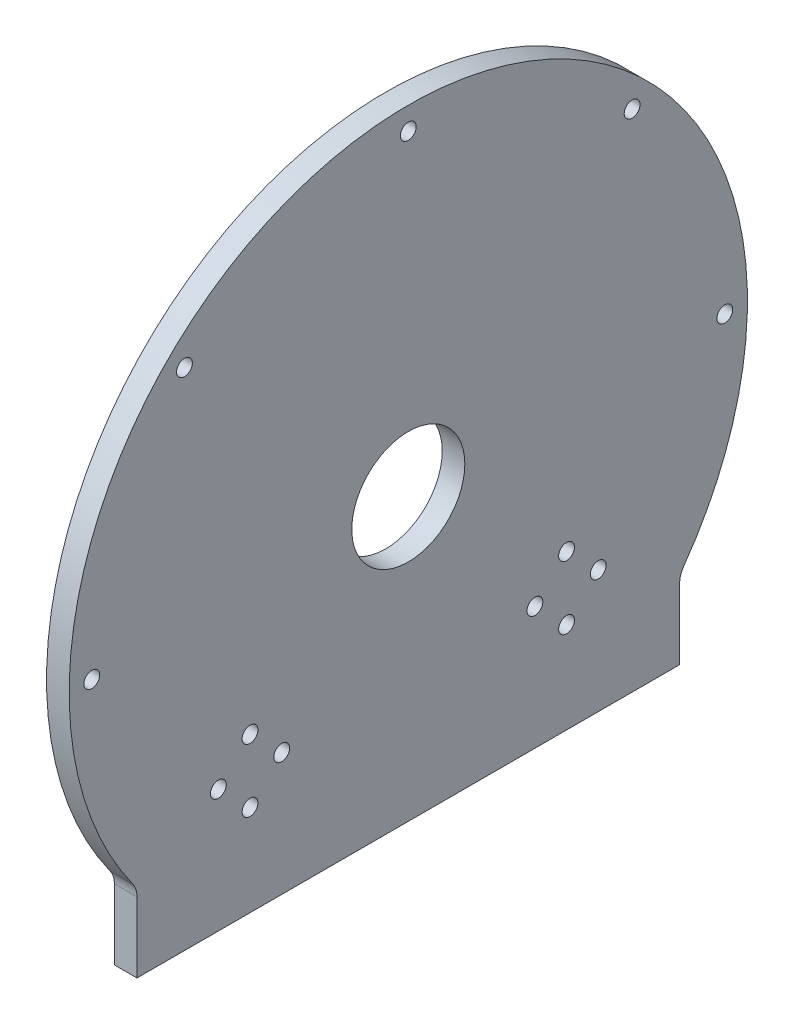
ISO-10303-21;
HEADER;
FILE_DESCRIPTION(('STEP AP214'),'2;1');
FILE_NAME('part.step','',(''),(''),'','','');
FILE_SCHEMA(('AUTOMOTIVE_DESIGN { 1 0 10303 214 1 1 1 1 }'));
ENDSEC;
DATA;
#1=APPLICATION_CONTEXT('core data for automotive mechanical design processes');
#2=APPLICATION_PROTOCOL_DEFINITION('international standard','automotive_design',2000,#1);
#3=PRODUCT_CONTEXT('',#1,'mechanical');
#4=PRODUCT('Part','Part','',(#3));
#5=PRODUCT_RELATED_PRODUCT_CATEGORY('part','',(#4));
#6=PRODUCT_DEFINITION_FORMATION('','',#4);
#7=PRODUCT_DEFINITION_CONTEXT('part definition',#1,'design');
#8=PRODUCT_DEFINITION('design','',#6,#7);
#9=PRODUCT_DEFINITION_SHAPE('','',#8);
#10=(LENGTH_UNIT() NAMED_UNIT(*) SI_UNIT(.MILLI.,.METRE.));
#11=(NAMED_UNIT(*) PLANE_ANGLE_UNIT() SI_UNIT($,.RADIAN.));
#12=(NAMED_UNIT(*) SI_UNIT($,.STERADIAN.) SOLID_ANGLE_UNIT());
#13=UNCERTAINTY_MEASURE_WITH_UNIT(LENGTH_MEASURE(1.E-05),#10,'distance_accuracy_value','');
#14=(GEOMETRIC_REPRESENTATION_CONTEXT(3) GLOBAL_UNCERTAINTY_ASSIGNED_CONTEXT((#13)) GLOBAL_UNIT_ASSIGNED_CONTEXT((#10,
#11,#12)) REPRESENTATION_CONTEXT('',''));
#15=CARTESIAN_POINT('',(0.,0.,0.));
#16=DIRECTION('',(0.,0.,1.));
#17=DIRECTION('',(1.,0.,0.));
#18=AXIS2_PLACEMENT_3D('',#15,#16,#17);
#19=CARTESIAN_POINT('',(5.,205.,-60.));
#20=DIRECTION('',(-1.,0.,0.));
#21=DIRECTION('',(0.,0.,1.));
#22=AXIS2_PLACEMENT_3D('',#19,#20,#21);
#23=PLANE('',#22);
#24=CARTESIAN_POINT('',(5.,254.497474683058,-10.5025253169412));
#25=DIRECTION('',(1.,0.,0.));
#26=DIRECTION('',(0.,0.,-1.));
#27=AXIS2_PLACEMENT_3D('',#24,#25,#26);
#28=CIRCLE('',#27,1.75);
#29=CARTESIAN_POINT('',(5.,254.497474683058,-12.2525253169412));
#30=VERTEX_POINT('',#29);
#31=EDGE_CURVE('E251',#30,#30,#28,.T.);
#32=ORIENTED_EDGE('',*,*,#31,.F.);
#33=EDGE_LOOP('',(#32));
#34=FACE_BOUND('',#33,.T.);
#35=CARTESIAN_POINT('',(5.,205.,10.));
#36=DIRECTION('',(1.,0.,0.));
#37=DIRECTION('',(0.,0.,-1.));
#38=AXIS2_PLACEMENT_3D('',#35,#36,#37);
#39=CIRCLE('',#38,1.75);
#40=CARTESIAN_POINT('',(5.,205.,8.25000000000002));
#41=VERTEX_POINT('',#40);
#42=EDGE_CURVE('E239',#41,#41,#39,.T.);
#43=ORIENTED_EDGE('',*,*,#42,.F.);
#44=EDGE_LOOP('',(#43));
#45=FACE_BOUND('',#44,.T.);
#46=CARTESIAN_POINT('',(5.,170.,-88.));
#47=DIRECTION('',(1.,0.,0.));
#48=DIRECTION('',(0.,0.,-1.));
#49=AXIS2_PLACEMENT_3D('',#46,#47,#48);
#50=CIRCLE('',#49,1.75);
#51=CARTESIAN_POINT('',(5.,170.,-89.75));
#52=VERTEX_POINT('',#51);
#53=EDGE_CURVE('E227',#52,#52,#50,.T.);
#54=ORIENTED_EDGE('',*,*,#53,.F.);
#55=EDGE_LOOP('',(#54));
#56=FACE_BOUND('',#55,.T.);
#57=CARTESIAN_POINT('',(5.,170.,-102.));
#58=DIRECTION('',(1.,0.,0.));
#59=DIRECTION('',(0.,0.,-1.));
#60=AXIS2_PLACEMENT_3D('',#57,#58,#59);
#61=CIRCLE('',#60,1.75);
#62=CARTESIAN_POINT('',(5.,170.,-103.75));
#63=VERTEX_POINT('',#62);
#64=EDGE_CURVE('E215',#63,#63,#61,.T.);
#65=ORIENTED_EDGE('',*,*,#64,.F.);
#66=EDGE_LOOP('',(#65));
#67=FACE_BOUND('',#66,.T.);
#68=CARTESIAN_POINT('',(5.,170.,-18.));
#69=DIRECTION('',(1.,0.,0.));
#70=DIRECTION('',(0.,0.,-1.));
#71=AXIS2_PLACEMENT_3D('',#68,#69,#70);
#72=CIRCLE('',#71,1.75);
#73=CARTESIAN_POINT('',(5.,170.,-19.75));
#74=VERTEX_POINT('',#73);
#75=EDGE_CURVE('E203',#74,#74,#72,.T.);
#76=ORIENTED_EDGE('',*,*,#75,.F.);
#77=EDGE_LOOP('',(#76));
#78=FACE_BOUND('',#77,.T.);
#79=CARTESIAN_POINT('',(5.,170.,-32.));
#80=DIRECTION('',(1.,0.,0.));
#81=DIRECTION('',(0.,0.,-1.));
#82=AXIS2_PLACEMENT_3D('',#79,#80,#81);
#83=CIRCLE('',#82,1.75);
#84=CARTESIAN_POINT('',(5.,170.,-33.75));
#85=VERTEX_POINT('',#84);
#86=EDGE_CURVE('E191',#85,#85,#83,.T.);
#87=ORIENTED_EDGE('',*,*,#86,.F.);
#88=EDGE_LOOP('',(#87));
#89=FACE_BOUND('',#88,.T.);
#90=CARTESIAN_POINT('',(5.,205.,-60.));
#91=DIRECTION('',(1.,0.,0.));
#92=DIRECTION('',(0.,0.,-1.));
#93=AXIS2_PLACEMENT_3D('',#90,#91,#92);
#94=CIRCLE('',#93,12.5);
#95=CARTESIAN_POINT('',(5.,205.,-72.5));
#96=VERTEX_POINT('',#95);
#97=EDGE_CURVE('E179',#96,#96,#94,.T.);
#98=ORIENTED_EDGE('',*,*,#97,.F.);
#99=EDGE_LOOP('',(#98));
#100=FACE_BOUND('',#99,.T.);
#101=DIRECTION('',(0.,-1.,0.));
#102=VECTOR('',#101,1.);
#103=CARTESIAN_POINT('',(5.,0.,0.));
#104=LINE('',#103,#102);
#105=CARTESIAN_POINT('',(5.,158.363104734556,0.));
#106=VERTEX_POINT('',#105);
#107=CARTESIAN_POINT('',(5.,142.822592062885,0.));
#108=VERTEX_POINT('',#107);
#109=EDGE_CURVE('E122',#106,#108,#104,.T.);
#110=ORIENTED_EDGE('',*,*,#109,.T.);
#111=DIRECTION('',(0.,0.,-1.));
#112=VECTOR('',#111,1.);
#113=CARTESIAN_POINT('',(5.,142.822592062885,-60.));
#114=LINE('',#113,#112);
#115=CARTESIAN_POINT('',(4.99999999999989,142.822592062885,-120.));
#116=VERTEX_POINT('',#115);
#117=EDGE_CURVE('E54',#108,#116,#114,.T.);
#118=ORIENTED_EDGE('',*,*,#117,.T.);
#119=DIRECTION('',(0.,1.,0.));
#120=VECTOR('',#119,1.);
#121=CARTESIAN_POINT('',(5.,0.,-120.));
#122=LINE('',#121,#120);
#123=CARTESIAN_POINT('',(5.,158.363104734556,-120.));
#124=VERTEX_POINT('',#123);
#125=EDGE_CURVE('E110',#116,#124,#122,.T.);
#126=ORIENTED_EDGE('',*,*,#125,.T.);
#127=CARTESIAN_POINT('',(5.,158.363104734556,-125.));
#128=DIRECTION('',(-1.,0.,0.));
#129=DIRECTION('',(0.,0.,1.));
#130=AXIS2_PLACEMENT_3D('',#127,#128,#129);
#131=CIRCLE('',#130,5.);
#132=CARTESIAN_POINT('',(5.,161.277910688646,-120.9375));
#133=VERTEX_POINT('',#132);
#134=EDGE_CURVE('E47',#124,#133,#131,.T.);
#135=ORIENTED_EDGE('',*,*,#134,.T.);
#136=CARTESIAN_POINT('',(5.,205.,-60.));
#137=DIRECTION('',(1.,0.,0.));
#138=DIRECTION('',(0.,0.,1.));
#139=AXIS2_PLACEMENT_3D('',#136,#137,#138);
#140=CIRCLE('',#139,75.);
#141=CARTESIAN_POINT('',(5.,161.277910688646,0.937500000000008));
#142=VERTEX_POINT('',#141);
#143=EDGE_CURVE('E113',#133,#142,#140,.T.);
#144=ORIENTED_EDGE('',*,*,#143,.T.);
#145=CARTESIAN_POINT('',(5.,158.363104734556,5.));
#146=DIRECTION('',(-1.,0.,0.));
#147=DIRECTION('',(0.,0.,1.));
#148=AXIS2_PLACEMENT_3D('',#145,#146,#147);
#149=CIRCLE('',#148,5.);
#150=EDGE_CURVE('E61',#142,#106,#149,.T.);
#151=ORIENTED_EDGE('',*,*,#150,.T.);
#152=EDGE_LOOP('',(#110,#118,#126,#135,#144,#151));
#153=FACE_BOUND('',#152,.T.);
#154=CARTESIAN_POINT('',(5.,177.,-25.));
#155=DIRECTION('',(1.,0.,0.));
#156=DIRECTION('',(0.,0.,-1.));
#157=AXIS2_PLACEMENT_3D('',#154,#155,#156);
#158=CIRCLE('',#157,1.75);
#159=CARTESIAN_POINT('',(5.,177.,-26.75));
#160=VERTEX_POINT('',#159);
#161=EDGE_CURVE('E186',#160,#160,#158,.T.);
#162=ORIENTED_EDGE('',*,*,#161,.F.);
#163=EDGE_LOOP('',(#162));
#164=FACE_BOUND('',#163,.T.);
#165=CARTESIAN_POINT('',(5.,163.,-25.));
#166=DIRECTION('',(1.,0.,0.));
#167=DIRECTION('',(0.,0.,-1.));
#168=AXIS2_PLACEMENT_3D('',#165,#166,#167);
#169=CIRCLE('',#168,1.75);
#170=CARTESIAN_POINT('',(5.,163.,-26.75));
#171=VERTEX_POINT('',#170);
#172=EDGE_CURVE('E197',#171,#171,#169,.T.);
#173=ORIENTED_EDGE('',*,*,#172,.F.);
#174=EDGE_LOOP('',(#173));
#175=FACE_BOUND('',#174,.T.);
#176=CARTESIAN_POINT('',(5.,177.,-95.));
#177=DIRECTION('',(1.,0.,0.));
#178=DIRECTION('',(0.,0.,-1.));
#179=AXIS2_PLACEMENT_3D('',#176,#177,#178);
#180=CIRCLE('',#179,1.75);
#181=CARTESIAN_POINT('',(5.,177.,-96.75));
#182=VERTEX_POINT('',#181);
#183=EDGE_CURVE('E209',#182,#182,#180,.T.);
#184=ORIENTED_EDGE('',*,*,#183,.F.);
#185=EDGE_LOOP('',(#184));
#186=FACE_BOUND('',#185,.T.);
#187=CARTESIAN_POINT('',(5.,163.,-95.));
#188=DIRECTION('',(1.,0.,0.));
#189=DIRECTION('',(0.,0.,-1.));
#190=AXIS2_PLACEMENT_3D('',#187,#188,#189);
#191=CIRCLE('',#190,1.75);
#192=CARTESIAN_POINT('',(5.,163.,-96.75));
#193=VERTEX_POINT('',#192);
#194=EDGE_CURVE('E221',#193,#193,#191,.T.);
#195=ORIENTED_EDGE('',*,*,#194,.F.);
#196=EDGE_LOOP('',(#195));
#197=FACE_BOUND('',#196,.T.);
#198=CARTESIAN_POINT('',(5.,275.,-60.));
#199=DIRECTION('',(1.,0.,0.));
#200=DIRECTION('',(0.,0.,-1.));
#201=AXIS2_PLACEMENT_3D('',#198,#199,#200);
#202=CIRCLE('',#201,1.75);
#203=CARTESIAN_POINT('',(5.,275.,-61.75));
#204=VERTEX_POINT('',#203);
#205=EDGE_CURVE('E233',#204,#204,#202,.T.);
#206=ORIENTED_EDGE('',*,*,#205,.F.);
#207=EDGE_LOOP('',(#206));
#208=FACE_BOUND('',#207,.T.);
#209=CARTESIAN_POINT('',(5.,205.,-130.));
#210=DIRECTION('',(1.,0.,0.));
#211=DIRECTION('',(0.,0.,-1.));
#212=AXIS2_PLACEMENT_3D('',#209,#210,#211);
#213=CIRCLE('',#212,1.75000000000001);
#214=CARTESIAN_POINT('',(5.,205.,-131.75));
#215=VERTEX_POINT('',#214);
#216=EDGE_CURVE('E245',#215,#215,#213,.T.);
#217=ORIENTED_EDGE('',*,*,#216,.F.);
#218=EDGE_LOOP('',(#217));
#219=FACE_BOUND('',#218,.T.);
#220=CARTESIAN_POINT('',(5.,254.497474683059,-109.497474683058));
#221=DIRECTION('',(1.,0.,0.));
#222=DIRECTION('',(0.,0.,-1.));
#223=AXIS2_PLACEMENT_3D('',#220,#221,#222);
#224=CIRCLE('',#223,1.75);
#225=CARTESIAN_POINT('',(5.,254.497474683059,-111.247474683058));
#226=VERTEX_POINT('',#225);
#227=EDGE_CURVE('E257',#226,#226,#224,.T.);
#228=ORIENTED_EDGE('',*,*,#227,.F.);
#229=EDGE_LOOP('',(#228));
#230=FACE_BOUND('',#229,.T.);
#231=ADVANCED_FACE('F39',(#34,#45,#56,#67,#78,#89,#100,#153,#164,#175,#186,#197,#208,#219,#230),
#23,.F.);
#232=CARTESIAN_POINT('',(0.,205.,-60.));
#233=DIRECTION('',(-1.,0.,0.));
#234=DIRECTION('',(0.,0.,1.));
#235=AXIS2_PLACEMENT_3D('',#232,#233,#234);
#236=PLANE('',#235);
#237=DIRECTION('',(0.,0.,-1.));
#238=VECTOR('',#237,1.);
#239=CARTESIAN_POINT('',(0.,142.822592062885,-60.));
#240=LINE('',#239,#238);
#241=CARTESIAN_POINT('',(-1.11022302462516E-13,142.822592062885,0.));
#242=VERTEX_POINT('',#241);
#243=CARTESIAN_POINT('',(-1.11022302462516E-13,142.822592062885,-120.));
#244=VERTEX_POINT('',#243);
#245=EDGE_CURVE('E92',#242,#244,#240,.T.);
#246=ORIENTED_EDGE('',*,*,#245,.F.);
#247=DIRECTION('',(0.,-1.,0.));
#248=VECTOR('',#247,1.);
#249=CARTESIAN_POINT('',(0.,0.,0.));
#250=LINE('',#249,#248);
#251=CARTESIAN_POINT('',(0.,158.363104734556,0.));
#252=VERTEX_POINT('',#251);
#253=EDGE_CURVE('E101',#252,#242,#250,.T.);
#254=ORIENTED_EDGE('',*,*,#253,.F.);
#255=CARTESIAN_POINT('',(0.,158.363104734556,5.));
#256=DIRECTION('',(-1.,0.,0.));
#257=DIRECTION('',(0.,0.,1.));
#258=AXIS2_PLACEMENT_3D('',#255,#256,#257);
#259=CIRCLE('',#258,5.);
#260=CARTESIAN_POINT('',(0.,161.277910688646,0.937500000000008));
#261=VERTEX_POINT('',#260);
#262=EDGE_CURVE('E129',#252,#261,#259,.F.);
#263=ORIENTED_EDGE('',*,*,#262,.T.);
#264=CARTESIAN_POINT('',(0.,205.,-60.));
#265=DIRECTION('',(1.,0.,0.));
#266=DIRECTION('',(0.,0.,1.));
#267=AXIS2_PLACEMENT_3D('',#264,#265,#266);
#268=CIRCLE('',#267,75.);
#269=CARTESIAN_POINT('',(0.,161.277910688646,-120.9375));
#270=VERTEX_POINT('',#269);
#271=EDGE_CURVE('E111',#270,#261,#268,.T.);
#272=ORIENTED_EDGE('',*,*,#271,.F.);
#273=CARTESIAN_POINT('',(0.,158.363104734556,-125.));
#274=DIRECTION('',(-1.,0.,0.));
#275=DIRECTION('',(0.,0.,1.));
#276=AXIS2_PLACEMENT_3D('',#273,#274,#275);
#277=CIRCLE('',#276,5.);
#278=CARTESIAN_POINT('',(0.,158.363104734556,-120.));
#279=VERTEX_POINT('',#278);
#280=EDGE_CURVE('E132',#270,#279,#277,.F.);
#281=ORIENTED_EDGE('',*,*,#280,.T.);
#282=DIRECTION('',(0.,1.,0.));
#283=VECTOR('',#282,1.);
#284=CARTESIAN_POINT('',(0.,0.,-120.));
#285=LINE('',#284,#283);
#286=EDGE_CURVE('E103',#244,#279,#285,.T.);
#287=ORIENTED_EDGE('',*,*,#286,.F.);
#288=EDGE_LOOP('',(#246,#254,#263,#272,#281,#287));
#289=FACE_BOUND('',#288,.T.);
#290=CARTESIAN_POINT('',(0.,254.497474683058,-10.5025253169412));
#291=DIRECTION('',(1.,0.,0.));
#292=DIRECTION('',(0.,0.,-1.));
#293=AXIS2_PLACEMENT_3D('',#290,#291,#292);
#294=CIRCLE('',#293,1.75);
#295=CARTESIAN_POINT('',(0.,254.497474683058,-12.2525253169412));
#296=VERTEX_POINT('',#295);
#297=EDGE_CURVE('E254',#296,#296,#294,.T.);
#298=ORIENTED_EDGE('',*,*,#297,.T.);
#299=EDGE_LOOP('',(#298));
#300=FACE_BOUND('',#299,.T.);
#301=CARTESIAN_POINT('',(0.,205.,10.));
#302=DIRECTION('',(1.,0.,0.));
#303=DIRECTION('',(0.,0.,-1.));
#304=AXIS2_PLACEMENT_3D('',#301,#302,#303);
#305=CIRCLE('',#304,1.75);
#306=CARTESIAN_POINT('',(0.,205.,8.25000000000002));
#307=VERTEX_POINT('',#306);
#308=EDGE_CURVE('E242',#307,#307,#305,.T.);
#309=ORIENTED_EDGE('',*,*,#308,.T.);
#310=EDGE_LOOP('',(#309));
#311=FACE_BOUND('',#310,.T.);
#312=CARTESIAN_POINT('',(0.,170.,-88.));
#313=DIRECTION('',(1.,0.,0.));
#314=DIRECTION('',(0.,0.,-1.));
#315=AXIS2_PLACEMENT_3D('',#312,#313,#314);
#316=CIRCLE('',#315,1.75);
#317=CARTESIAN_POINT('',(0.,170.,-89.75));
#318=VERTEX_POINT('',#317);
#319=EDGE_CURVE('E230',#318,#318,#316,.T.);
#320=ORIENTED_EDGE('',*,*,#319,.T.);
#321=EDGE_LOOP('',(#320));
#322=FACE_BOUND('',#321,.T.);
#323=CARTESIAN_POINT('',(0.,170.,-102.));
#324=DIRECTION('',(1.,0.,0.));
#325=DIRECTION('',(0.,0.,-1.));
#326=AXIS2_PLACEMENT_3D('',#323,#324,#325);
#327=CIRCLE('',#326,1.75);
#328=CARTESIAN_POINT('',(0.,170.,-103.75));
#329=VERTEX_POINT('',#328);
#330=EDGE_CURVE('E218',#329,#329,#327,.T.);
#331=ORIENTED_EDGE('',*,*,#330,.T.);
#332=EDGE_LOOP('',(#331));
#333=FACE_BOUND('',#332,.T.);
#334=CARTESIAN_POINT('',(0.,170.,-18.));
#335=DIRECTION('',(1.,0.,0.));
#336=DIRECTION('',(0.,0.,-1.));
#337=AXIS2_PLACEMENT_3D('',#334,#335,#336);
#338=CIRCLE('',#337,1.75);
#339=CARTESIAN_POINT('',(0.,170.,-19.75));
#340=VERTEX_POINT('',#339);
#341=EDGE_CURVE('E206',#340,#340,#338,.T.);
#342=ORIENTED_EDGE('',*,*,#341,.T.);
#343=EDGE_LOOP('',(#342));
#344=FACE_BOUND('',#343,.T.);
#345=CARTESIAN_POINT('',(0.,170.,-32.));
#346=DIRECTION('',(1.,0.,0.));
#347=DIRECTION('',(0.,0.,-1.));
#348=AXIS2_PLACEMENT_3D('',#345,#346,#347);
#349=CIRCLE('',#348,1.75);
#350=CARTESIAN_POINT('',(0.,170.,-33.75));
#351=VERTEX_POINT('',#350);
#352=EDGE_CURVE('E194',#351,#351,#349,.T.);
#353=ORIENTED_EDGE('',*,*,#352,.T.);
#354=EDGE_LOOP('',(#353));
#355=FACE_BOUND('',#354,.T.);
#356=CARTESIAN_POINT('',(0.,205.,-60.));
#357=DIRECTION('',(1.,0.,0.));
#358=DIRECTION('',(0.,0.,-1.));
#359=AXIS2_PLACEMENT_3D('',#356,#357,#358);
#360=CIRCLE('',#359,12.5);
#361=CARTESIAN_POINT('',(0.,205.,-72.5));
#362=VERTEX_POINT('',#361);
#363=EDGE_CURVE('E181',#362,#362,#360,.T.);
#364=ORIENTED_EDGE('',*,*,#363,.T.);
#365=EDGE_LOOP('',(#364));
#366=FACE_BOUND('',#365,.T.);
#367=CARTESIAN_POINT('',(0.,177.,-25.));
#368=DIRECTION('',(1.,0.,0.));
#369=DIRECTION('',(0.,0.,-1.));
#370=AXIS2_PLACEMENT_3D('',#367,#368,#369);
#371=CIRCLE('',#370,1.75);
#372=CARTESIAN_POINT('',(0.,177.,-26.75));
#373=VERTEX_POINT('',#372);
#374=EDGE_CURVE('E188',#373,#373,#371,.T.);
#375=ORIENTED_EDGE('',*,*,#374,.T.);
#376=EDGE_LOOP('',(#375));
#377=FACE_BOUND('',#376,.T.);
#378=CARTESIAN_POINT('',(0.,163.,-25.));
#379=DIRECTION('',(1.,0.,0.));
#380=DIRECTION('',(0.,0.,-1.));
#381=AXIS2_PLACEMENT_3D('',#378,#379,#380);
#382=CIRCLE('',#381,1.75);
#383=CARTESIAN_POINT('',(0.,163.,-26.75));
#384=VERTEX_POINT('',#383);
#385=EDGE_CURVE('E200',#384,#384,#382,.T.);
#386=ORIENTED_EDGE('',*,*,#385,.T.);
#387=EDGE_LOOP('',(#386));
#388=FACE_BOUND('',#387,.T.);
#389=CARTESIAN_POINT('',(0.,177.,-95.));
#390=DIRECTION('',(1.,0.,0.));
#391=DIRECTION('',(0.,0.,-1.));
#392=AXIS2_PLACEMENT_3D('',#389,#390,#391);
#393=CIRCLE('',#392,1.75);
#394=CARTESIAN_POINT('',(0.,177.,-96.75));
#395=VERTEX_POINT('',#394);
#396=EDGE_CURVE('E212',#395,#395,#393,.T.);
#397=ORIENTED_EDGE('',*,*,#396,.T.);
#398=EDGE_LOOP('',(#397));
#399=FACE_BOUND('',#398,.T.);
#400=CARTESIAN_POINT('',(0.,163.,-95.));
#401=DIRECTION('',(1.,0.,0.));
#402=DIRECTION('',(0.,0.,-1.));
#403=AXIS2_PLACEMENT_3D('',#400,#401,#402);
#404=CIRCLE('',#403,1.75);
#405=CARTESIAN_POINT('',(0.,163.,-96.75));
#406=VERTEX_POINT('',#405);
#407=EDGE_CURVE('E224',#406,#406,#404,.T.);
#408=ORIENTED_EDGE('',*,*,#407,.T.);
#409=EDGE_LOOP('',(#408));
#410=FACE_BOUND('',#409,.T.);
#411=CARTESIAN_POINT('',(0.,275.,-60.));
#412=DIRECTION('',(1.,0.,0.));
#413=DIRECTION('',(0.,0.,-1.));
#414=AXIS2_PLACEMENT_3D('',#411,#412,#413);
#415=CIRCLE('',#414,1.75);
#416=CARTESIAN_POINT('',(0.,275.,-61.75));
#417=VERTEX_POINT('',#416);
#418=EDGE_CURVE('E236',#417,#417,#415,.T.);
#419=ORIENTED_EDGE('',*,*,#418,.T.);
#420=EDGE_LOOP('',(#419));
#421=FACE_BOUND('',#420,.T.);
#422=CARTESIAN_POINT('',(0.,205.,-130.));
#423=DIRECTION('',(1.,0.,0.));
#424=DIRECTION('',(0.,0.,-1.));
#425=AXIS2_PLACEMENT_3D('',#422,#423,#424);
#426=CIRCLE('',#425,1.75000000000001);
#427=CARTESIAN_POINT('',(0.,205.,-131.75));
#428=VERTEX_POINT('',#427);
#429=EDGE_CURVE('E248',#428,#428,#426,.T.);
#430=ORIENTED_EDGE('',*,*,#429,.T.);
#431=EDGE_LOOP('',(#430));
#432=FACE_BOUND('',#431,.T.);
#433=CARTESIAN_POINT('',(0.,254.497474683059,-109.497474683058));
#434=DIRECTION('',(1.,0.,0.));
#435=DIRECTION('',(0.,0.,-1.));
#436=AXIS2_PLACEMENT_3D('',#433,#434,#435);
#437=CIRCLE('',#436,1.75);
#438=CARTESIAN_POINT('',(0.,254.497474683059,-111.247474683058));
#439=VERTEX_POINT('',#438);
#440=EDGE_CURVE('E260',#439,#439,#437,.T.);
#441=ORIENTED_EDGE('',*,*,#440,.T.);
#442=EDGE_LOOP('',(#441));
#443=FACE_BOUND('',#442,.T.);
#444=ADVANCED_FACE('F99',(#289,#300,#311,#322,#333,#344,#355,#366,#377,#388,#399,#410,#421,#432,
#443),#236,.T.);
#445=CARTESIAN_POINT('',(5.,0.,-120.));
#446=DIRECTION('',(0.,0.,1.));
#447=DIRECTION('',(0.,-1.,0.));
#448=AXIS2_PLACEMENT_3D('',#445,#446,#447);
#449=PLANE('',#448);
#450=ORIENTED_EDGE('',*,*,#125,.F.);
#451=DIRECTION('',(1.,0.,0.));
#452=VECTOR('',#451,1.);
#453=CARTESIAN_POINT('',(-403.358691040627,142.822592062885,-120.));
#454=LINE('',#453,#452);
#455=EDGE_CURVE('E104',#244,#116,#454,.T.);
#456=ORIENTED_EDGE('',*,*,#455,.F.);
#457=ORIENTED_EDGE('',*,*,#286,.T.);
#458=DIRECTION('',(1.,0.,0.));
#459=VECTOR('',#458,1.);
#460=CARTESIAN_POINT('',(5.,158.363104734556,-120.));
#461=LINE('',#460,#459);
#462=EDGE_CURVE('E119',#279,#124,#461,.T.);
#463=ORIENTED_EDGE('',*,*,#462,.T.);
#464=EDGE_LOOP('',(#450,#456,#457,#463));
#465=FACE_BOUND('',#464,.T.);
#466=ADVANCED_FACE('F164',(#465),#449,.F.);
#467=CARTESIAN_POINT('',(5.,205.,-60.));
#468=DIRECTION('',(-1.,0.,0.));
#469=DIRECTION('',(0.,0.,1.));
#470=AXIS2_PLACEMENT_3D('',#467,#468,#469);
#471=CYLINDRICAL_SURFACE('',#470,75.);
#472=ORIENTED_EDGE('',*,*,#271,.T.);
#473=DIRECTION('',(-1.,0.,0.));
#474=VECTOR('',#473,1.);
#475=CARTESIAN_POINT('',(5.,161.277910688646,0.937500000000008));
#476=LINE('',#475,#474);
#477=EDGE_CURVE('E127',#261,#142,#476,.F.);
#478=ORIENTED_EDGE('',*,*,#477,.T.);
#479=ORIENTED_EDGE('',*,*,#143,.F.);
#480=DIRECTION('',(-1.,0.,0.));
#481=VECTOR('',#480,1.);
#482=CARTESIAN_POINT('',(5.,161.277910688646,-120.9375));
#483=LINE('',#482,#481);
#484=EDGE_CURVE('E124',#133,#270,#483,.T.);
#485=ORIENTED_EDGE('',*,*,#484,.T.);
#486=EDGE_LOOP('',(#472,#478,#479,#485));
#487=FACE_BOUND('',#486,.T.);
#488=ADVANCED_FACE('F141',(#487),#471,.T.);
#489=CARTESIAN_POINT('',(5.,0.,0.));
#490=DIRECTION('',(0.,0.,-1.));
#491=DIRECTION('',(-1.,0.,0.));
#492=AXIS2_PLACEMENT_3D('',#489,#490,#491);
#493=PLANE('',#492);
#494=ORIENTED_EDGE('',*,*,#253,.T.);
#495=DIRECTION('',(1.,0.,0.));
#496=VECTOR('',#495,1.);
#497=CARTESIAN_POINT('',(5.,142.822592062885,0.));
#498=LINE('',#497,#496);
#499=EDGE_CURVE('E11',#242,#108,#498,.T.);
#500=ORIENTED_EDGE('',*,*,#499,.T.);
#501=ORIENTED_EDGE('',*,*,#109,.F.);
#502=DIRECTION('',(1.,0.,0.));
#503=VECTOR('',#502,1.);
#504=CARTESIAN_POINT('',(0.,158.363104734556,0.));
#505=LINE('',#504,#503);
#506=EDGE_CURVE('E109',#106,#252,#505,.F.);
#507=ORIENTED_EDGE('',*,*,#506,.T.);
#508=EDGE_LOOP('',(#494,#500,#501,#507));
#509=FACE_BOUND('',#508,.T.);
#510=ADVANCED_FACE('F107',(#509),#493,.F.);
#511=CARTESIAN_POINT('',(5.,205.,-60.));
#512=DIRECTION('',(-1.,0.,0.));
#513=DIRECTION('',(0.,0.,1.));
#514=AXIS2_PLACEMENT_3D('',#511,#512,#513);
#515=CYLINDRICAL_SURFACE('',#514,12.5);
#516=ORIENTED_EDGE('',*,*,#97,.T.);
#517=EDGE_LOOP('',(#516));
#518=FACE_BOUND('',#517,.T.);
#519=ORIENTED_EDGE('',*,*,#363,.F.);
#520=EDGE_LOOP('',(#519));
#521=FACE_BOUND('',#520,.T.);
#522=ADVANCED_FACE('F169',(#518,#521),#515,.F.);
#523=CARTESIAN_POINT('',(5.,177.,-25.));
#524=DIRECTION('',(-1.,0.,0.));
#525=DIRECTION('',(0.,0.,1.));
#526=AXIS2_PLACEMENT_3D('',#523,#524,#525);
#527=CYLINDRICAL_SURFACE('',#526,1.75);
#528=ORIENTED_EDGE('',*,*,#161,.T.);
#529=EDGE_LOOP('',(#528));
#530=FACE_BOUND('',#529,.T.);
#531=ORIENTED_EDGE('',*,*,#374,.F.);
#532=EDGE_LOOP('',(#531));
#533=FACE_BOUND('',#532,.T.);
#534=ADVANCED_FACE('F342',(#530,#533),#527,.F.);
#535=CARTESIAN_POINT('',(5.,170.,-32.));
#536=DIRECTION('',(-1.,0.,0.));
#537=DIRECTION('',(0.,0.,1.));
#538=AXIS2_PLACEMENT_3D('',#535,#536,#537);
#539=CYLINDRICAL_SURFACE('',#538,1.75);
#540=ORIENTED_EDGE('',*,*,#86,.T.);
#541=EDGE_LOOP('',(#540));
#542=FACE_BOUND('',#541,.T.);
#543=ORIENTED_EDGE('',*,*,#352,.F.);
#544=EDGE_LOOP('',(#543));
#545=FACE_BOUND('',#544,.T.);
#546=ADVANCED_FACE('F339',(#542,#545),#539,.F.);
#547=CARTESIAN_POINT('',(5.,163.,-25.));
#548=DIRECTION('',(-1.,0.,0.));
#549=DIRECTION('',(0.,0.,1.));
#550=AXIS2_PLACEMENT_3D('',#547,#548,#549);
#551=CYLINDRICAL_SURFACE('',#550,1.75);
#552=ORIENTED_EDGE('',*,*,#172,.T.);
#553=EDGE_LOOP('',(#552));
#554=FACE_BOUND('',#553,.T.);
#555=ORIENTED_EDGE('',*,*,#385,.F.);
#556=EDGE_LOOP('',(#555));
#557=FACE_BOUND('',#556,.T.);
#558=ADVANCED_FACE('F335',(#554,#557),#551,.F.);
#559=CARTESIAN_POINT('',(5.,170.,-18.));
#560=DIRECTION('',(-1.,0.,0.));
#561=DIRECTION('',(0.,0.,1.));
#562=AXIS2_PLACEMENT_3D('',#559,#560,#561);
#563=CYLINDRICAL_SURFACE('',#562,1.75);
#564=ORIENTED_EDGE('',*,*,#75,.T.);
#565=EDGE_LOOP('',(#564));
#566=FACE_BOUND('',#565,.T.);
#567=ORIENTED_EDGE('',*,*,#341,.F.);
#568=EDGE_LOOP('',(#567));
#569=FACE_BOUND('',#568,.T.);
#570=ADVANCED_FACE('F331',(#566,#569),#563,.F.);
#571=CARTESIAN_POINT('',(5.,177.,-95.));
#572=DIRECTION('',(-1.,0.,0.));
#573=DIRECTION('',(0.,0.,1.));
#574=AXIS2_PLACEMENT_3D('',#571,#572,#573);
#575=CYLINDRICAL_SURFACE('',#574,1.75);
#576=ORIENTED_EDGE('',*,*,#183,.T.);
#577=EDGE_LOOP('',(#576));
#578=FACE_BOUND('',#577,.T.);
#579=ORIENTED_EDGE('',*,*,#396,.F.);
#580=EDGE_LOOP('',(#579));
#581=FACE_BOUND('',#580,.T.);
#582=ADVANCED_FACE('F327',(#578,#581),#575,.F.);
#583=CARTESIAN_POINT('',(5.,170.,-102.));
#584=DIRECTION('',(-1.,0.,0.));
#585=DIRECTION('',(0.,0.,1.));
#586=AXIS2_PLACEMENT_3D('',#583,#584,#585);
#587=CYLINDRICAL_SURFACE('',#586,1.75);
#588=ORIENTED_EDGE('',*,*,#64,.T.);
#589=EDGE_LOOP('',(#588));
#590=FACE_BOUND('',#589,.T.);
#591=ORIENTED_EDGE('',*,*,#330,.F.);
#592=EDGE_LOOP('',(#591));
#593=FACE_BOUND('',#592,.T.);
#594=ADVANCED_FACE('F323',(#590,#593),#587,.F.);
#595=CARTESIAN_POINT('',(5.,163.,-95.));
#596=DIRECTION('',(-1.,0.,0.));
#597=DIRECTION('',(0.,0.,1.));
#598=AXIS2_PLACEMENT_3D('',#595,#596,#597);
#599=CYLINDRICAL_SURFACE('',#598,1.75);
#600=ORIENTED_EDGE('',*,*,#194,.T.);
#601=EDGE_LOOP('',(#600));
#602=FACE_BOUND('',#601,.T.);
#603=ORIENTED_EDGE('',*,*,#407,.F.);
#604=EDGE_LOOP('',(#603));
#605=FACE_BOUND('',#604,.T.);
#606=ADVANCED_FACE('F319',(#602,#605),#599,.F.);
#607=CARTESIAN_POINT('',(5.,170.,-88.));
#608=DIRECTION('',(-1.,0.,0.));
#609=DIRECTION('',(0.,0.,1.));
#610=AXIS2_PLACEMENT_3D('',#607,#608,#609);
#611=CYLINDRICAL_SURFACE('',#610,1.75);
#612=ORIENTED_EDGE('',*,*,#53,.T.);
#613=EDGE_LOOP('',(#612));
#614=FACE_BOUND('',#613,.T.);
#615=ORIENTED_EDGE('',*,*,#319,.F.);
#616=EDGE_LOOP('',(#615));
#617=FACE_BOUND('',#616,.T.);
#618=ADVANCED_FACE('F315',(#614,#617),#611,.F.);
#619=CARTESIAN_POINT('',(5.,275.,-60.));
#620=DIRECTION('',(-1.,0.,0.));
#621=DIRECTION('',(0.,0.,1.));
#622=AXIS2_PLACEMENT_3D('',#619,#620,#621);
#623=CYLINDRICAL_SURFACE('',#622,1.75);
#624=ORIENTED_EDGE('',*,*,#205,.T.);
#625=EDGE_LOOP('',(#624));
#626=FACE_BOUND('',#625,.T.);
#627=ORIENTED_EDGE('',*,*,#418,.F.);
#628=EDGE_LOOP('',(#627));
#629=FACE_BOUND('',#628,.T.);
#630=ADVANCED_FACE('F309',(#626,#629),#623,.F.);
#631=CARTESIAN_POINT('',(5.,205.,10.));
#632=DIRECTION('',(-1.,0.,0.));
#633=DIRECTION('',(0.,0.,1.));
#634=AXIS2_PLACEMENT_3D('',#631,#632,#633);
#635=CYLINDRICAL_SURFACE('',#634,1.75);
#636=ORIENTED_EDGE('',*,*,#42,.T.);
#637=EDGE_LOOP('',(#636));
#638=FACE_BOUND('',#637,.T.);
#639=ORIENTED_EDGE('',*,*,#308,.F.);
#640=EDGE_LOOP('',(#639));
#641=FACE_BOUND('',#640,.T.);
#642=ADVANCED_FACE('F303',(#638,#641),#635,.F.);
#643=CARTESIAN_POINT('',(5.,205.,-130.));
#644=DIRECTION('',(-1.,0.,0.));
#645=DIRECTION('',(0.,0.,1.));
#646=AXIS2_PLACEMENT_3D('',#643,#644,#645);
#647=CYLINDRICAL_SURFACE('',#646,1.75000000000001);
#648=ORIENTED_EDGE('',*,*,#216,.T.);
#649=EDGE_LOOP('',(#648));
#650=FACE_BOUND('',#649,.T.);
#651=ORIENTED_EDGE('',*,*,#429,.F.);
#652=EDGE_LOOP('',(#651));
#653=FACE_BOUND('',#652,.T.);
#654=ADVANCED_FACE('F274',(#650,#653),#647,.F.);
#655=CARTESIAN_POINT('',(5.,254.497474683058,-10.5025253169412));
#656=DIRECTION('',(-1.,0.,0.));
#657=DIRECTION('',(0.,0.,1.));
#658=AXIS2_PLACEMENT_3D('',#655,#656,#657);
#659=CYLINDRICAL_SURFACE('',#658,1.75);
#660=ORIENTED_EDGE('',*,*,#31,.T.);
#661=EDGE_LOOP('',(#660));
#662=FACE_BOUND('',#661,.T.);
#663=ORIENTED_EDGE('',*,*,#297,.F.);
#664=EDGE_LOOP('',(#663));
#665=FACE_BOUND('',#664,.T.);
#666=ADVANCED_FACE('F153',(#662,#665),#659,.F.);
#667=CARTESIAN_POINT('',(5.,254.497474683059,-109.497474683058));
#668=DIRECTION('',(-1.,0.,0.));
#669=DIRECTION('',(0.,0.,1.));
#670=AXIS2_PLACEMENT_3D('',#667,#668,#669);
#671=CYLINDRICAL_SURFACE('',#670,1.75);
#672=ORIENTED_EDGE('',*,*,#227,.T.);
#673=EDGE_LOOP('',(#672));
#674=FACE_BOUND('',#673,.T.);
#675=ORIENTED_EDGE('',*,*,#440,.F.);
#676=EDGE_LOOP('',(#675));
#677=FACE_BOUND('',#676,.T.);
#678=ADVANCED_FACE('F148',(#674,#677),#671,.F.);
#679=CARTESIAN_POINT('',(5.,158.363104734556,5.));
#680=DIRECTION('',(-1.,0.,0.));
#681=DIRECTION('',(0.,0.,1.));
#682=AXIS2_PLACEMENT_3D('',#679,#680,#681);
#683=CYLINDRICAL_SURFACE('',#682,5.);
#684=ORIENTED_EDGE('',*,*,#150,.F.);
#685=ORIENTED_EDGE('',*,*,#477,.F.);
#686=ORIENTED_EDGE('',*,*,#262,.F.);
#687=ORIENTED_EDGE('',*,*,#506,.F.);
#688=EDGE_LOOP('',(#684,#685,#686,#687));
#689=FACE_BOUND('',#688,.T.);
#690=ADVANCED_FACE('F146',(#689),#683,.F.);
#691=CARTESIAN_POINT('',(5.,158.363104734556,-125.));
#692=DIRECTION('',(-1.,0.,0.));
#693=DIRECTION('',(0.,0.,1.));
#694=AXIS2_PLACEMENT_3D('',#691,#692,#693);
#695=CYLINDRICAL_SURFACE('',#694,5.);
#696=ORIENTED_EDGE('',*,*,#134,.F.);
#697=ORIENTED_EDGE('',*,*,#462,.F.);
#698=ORIENTED_EDGE('',*,*,#280,.F.);
#699=ORIENTED_EDGE('',*,*,#484,.F.);
#700=EDGE_LOOP('',(#696,#697,#698,#699));
#701=FACE_BOUND('',#700,.T.);
#702=ADVANCED_FACE('F41',(#701),#695,.F.);
#703=CARTESIAN_POINT('',(-403.358691040627,142.822592062885,-120.));
#704=DIRECTION('',(0.,1.,0.));
#705=DIRECTION('',(0.,0.,1.));
#706=AXIS2_PLACEMENT_3D('',#703,#704,#705);
#707=PLANE('',#706);
#708=ORIENTED_EDGE('',*,*,#117,.F.);
#709=ORIENTED_EDGE('',*,*,#499,.F.);
#710=ORIENTED_EDGE('',*,*,#245,.T.);
#711=ORIENTED_EDGE('',*,*,#455,.T.);
#712=EDGE_LOOP('',(#708,#709,#710,#711));
#713=FACE_BOUND('',#712,.T.);
#714=ADVANCED_FACE('F91',(#713),#707,.F.);
#715=CLOSED_SHELL('',(#231,#444,#466,#488,#510,#522,#534,#546,#558,#570,#582,#594,#606,#618,
#630,#642,#654,#666,#678,#690,#702,#714));
#716=MANIFOLD_SOLID_BREP('B2',#715);
#717=ADVANCED_BREP_SHAPE_REPRESENTATION('',(#18,#716),#14);
#718=SHAPE_DEFINITION_REPRESENTATION(#9,#717);
ENDSEC;
END-ISO-10303-21;
